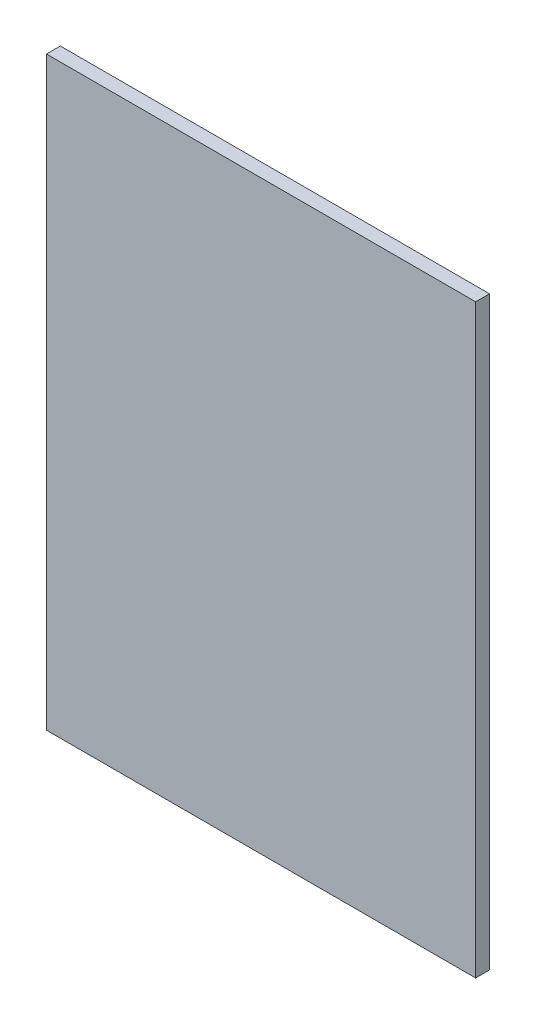
ISO-10303-21;
HEADER;
FILE_DESCRIPTION(('STEP AP214'),'2;1');
FILE_NAME('part.step','',(''),(''),'','','');
FILE_SCHEMA(('AUTOMOTIVE_DESIGN { 1 0 10303 214 1 1 1 1 }'));
ENDSEC;
DATA;
#1=APPLICATION_CONTEXT('core data for automotive mechanical design processes');
#2=APPLICATION_PROTOCOL_DEFINITION('international standard','automotive_design',2000,#1);
#3=PRODUCT_CONTEXT('',#1,'mechanical');
#4=PRODUCT('Part','Part','',(#3));
#5=PRODUCT_RELATED_PRODUCT_CATEGORY('part','',(#4));
#6=PRODUCT_DEFINITION_FORMATION('','',#4);
#7=PRODUCT_DEFINITION_CONTEXT('part definition',#1,'design');
#8=PRODUCT_DEFINITION('design','',#6,#7);
#9=PRODUCT_DEFINITION_SHAPE('','',#8);
#10=(LENGTH_UNIT() NAMED_UNIT(*) SI_UNIT(.MILLI.,.METRE.));
#11=(NAMED_UNIT(*) PLANE_ANGLE_UNIT() SI_UNIT($,.RADIAN.));
#12=(NAMED_UNIT(*) SI_UNIT($,.STERADIAN.) SOLID_ANGLE_UNIT());
#13=UNCERTAINTY_MEASURE_WITH_UNIT(LENGTH_MEASURE(1.E-05),#10,'distance_accuracy_value','');
#14=(GEOMETRIC_REPRESENTATION_CONTEXT(3) GLOBAL_UNCERTAINTY_ASSIGNED_CONTEXT((#13)) GLOBAL_UNIT_ASSIGNED_CONTEXT((#10,
#11,#12)) REPRESENTATION_CONTEXT('',''));
#15=CARTESIAN_POINT('',(0.,0.,0.));
#16=DIRECTION('',(0.,0.,1.));
#17=DIRECTION('',(1.,0.,0.));
#18=AXIS2_PLACEMENT_3D('',#15,#16,#17);
#19=CARTESIAN_POINT('',(0.,760.,18.));
#20=DIRECTION('',(0.,1.,0.));
#21=DIRECTION('',(0.,0.,1.));
#22=AXIS2_PLACEMENT_3D('',#19,#20,#21);
#23=PLANE('',#22);
#24=DIRECTION('',(1.,0.,0.));
#25=VECTOR('',#24,1.);
#26=CARTESIAN_POINT('',(0.,760.,0.));
#27=LINE('',#26,#25);
#28=CARTESIAN_POINT('',(0.,760.,0.));
#29=VERTEX_POINT('',#28);
#30=CARTESIAN_POINT('',(557.,760.,0.));
#31=VERTEX_POINT('',#30);
#32=EDGE_CURVE('E98',#29,#31,#27,.T.);
#33=ORIENTED_EDGE('',*,*,#32,.F.);
#34=DIRECTION('',(0.,0.,-1.));
#35=VECTOR('',#34,1.);
#36=CARTESIAN_POINT('',(0.,760.,18.));
#37=LINE('',#36,#35);
#38=CARTESIAN_POINT('',(0.,760.,18.));
#39=VERTEX_POINT('',#38);
#40=EDGE_CURVE('E11',#39,#29,#37,.T.);
#41=ORIENTED_EDGE('',*,*,#40,.F.);
#42=DIRECTION('',(1.,0.,0.));
#43=VECTOR('',#42,1.);
#44=CARTESIAN_POINT('',(0.,760.,18.));
#45=LINE('',#44,#43);
#46=CARTESIAN_POINT('',(557.,760.,18.));
#47=VERTEX_POINT('',#46);
#48=EDGE_CURVE('E93',#39,#47,#45,.T.);
#49=ORIENTED_EDGE('',*,*,#48,.T.);
#50=DIRECTION('',(0.,0.,-1.));
#51=VECTOR('',#50,1.);
#52=CARTESIAN_POINT('',(557.,760.,18.));
#53=LINE('',#52,#51);
#54=EDGE_CURVE('E36',#47,#31,#53,.T.);
#55=ORIENTED_EDGE('',*,*,#54,.T.);
#56=EDGE_LOOP('',(#33,#41,#49,#55));
#57=FACE_BOUND('',#56,.T.);
#58=ADVANCED_FACE('F33',(#57),#23,.T.);
#59=CARTESIAN_POINT('',(0.,760.,18.));
#60=DIRECTION('',(1.,0.,0.));
#61=DIRECTION('',(0.,0.,-1.));
#62=AXIS2_PLACEMENT_3D('',#59,#60,#61);
#63=PLANE('',#62);
#64=DIRECTION('',(0.,-1.,0.));
#65=VECTOR('',#64,1.);
#66=CARTESIAN_POINT('',(0.,760.,0.));
#67=LINE('',#66,#65);
#68=CARTESIAN_POINT('',(0.,0.,0.));
#69=VERTEX_POINT('',#68);
#70=EDGE_CURVE('E66',#29,#69,#67,.T.);
#71=ORIENTED_EDGE('',*,*,#70,.T.);
#72=DIRECTION('',(0.,0.,-1.));
#73=VECTOR('',#72,1.);
#74=CARTESIAN_POINT('',(0.,0.,18.));
#75=LINE('',#74,#73);
#76=CARTESIAN_POINT('',(0.,0.,18.));
#77=VERTEX_POINT('',#76);
#78=EDGE_CURVE('E42',#77,#69,#75,.T.);
#79=ORIENTED_EDGE('',*,*,#78,.F.);
#80=DIRECTION('',(0.,-1.,0.));
#81=VECTOR('',#80,1.);
#82=CARTESIAN_POINT('',(0.,760.,18.));
#83=LINE('',#82,#81);
#84=EDGE_CURVE('E83',#39,#77,#83,.T.);
#85=ORIENTED_EDGE('',*,*,#84,.F.);
#86=ORIENTED_EDGE('',*,*,#40,.T.);
#87=EDGE_LOOP('',(#71,#79,#85,#86));
#88=FACE_BOUND('',#87,.T.);
#89=ADVANCED_FACE('F108',(#88),#63,.F.);
#90=CARTESIAN_POINT('',(0.,0.,18.));
#91=DIRECTION('',(0.,1.,0.));
#92=DIRECTION('',(0.,0.,1.));
#93=AXIS2_PLACEMENT_3D('',#90,#91,#92);
#94=PLANE('',#93);
#95=DIRECTION('',(1.,0.,0.));
#96=VECTOR('',#95,1.);
#97=CARTESIAN_POINT('',(0.,0.,0.));
#98=LINE('',#97,#96);
#99=CARTESIAN_POINT('',(557.,0.,0.));
#100=VERTEX_POINT('',#99);
#101=EDGE_CURVE('E90',#69,#100,#98,.T.);
#102=ORIENTED_EDGE('',*,*,#101,.T.);
#103=DIRECTION('',(0.,0.,-1.));
#104=VECTOR('',#103,1.);
#105=CARTESIAN_POINT('',(557.,0.,18.));
#106=LINE('',#105,#104);
#107=CARTESIAN_POINT('',(557.,0.,18.));
#108=VERTEX_POINT('',#107);
#109=EDGE_CURVE('E87',#108,#100,#106,.T.);
#110=ORIENTED_EDGE('',*,*,#109,.F.);
#111=DIRECTION('',(1.,0.,0.));
#112=VECTOR('',#111,1.);
#113=CARTESIAN_POINT('',(0.,0.,18.));
#114=LINE('',#113,#112);
#115=EDGE_CURVE('E78',#77,#108,#114,.T.);
#116=ORIENTED_EDGE('',*,*,#115,.F.);
#117=ORIENTED_EDGE('',*,*,#78,.T.);
#118=EDGE_LOOP('',(#102,#110,#116,#117));
#119=FACE_BOUND('',#118,.T.);
#120=ADVANCED_FACE('F88',(#119),#94,.F.);
#121=CARTESIAN_POINT('',(557.,760.,18.));
#122=DIRECTION('',(1.,0.,0.));
#123=DIRECTION('',(0.,1.,0.));
#124=AXIS2_PLACEMENT_3D('',#121,#122,#123);
#125=PLANE('',#124);
#126=DIRECTION('',(0.,-1.,0.));
#127=VECTOR('',#126,1.);
#128=CARTESIAN_POINT('',(557.,760.,0.));
#129=LINE('',#128,#127);
#130=EDGE_CURVE('E101',#31,#100,#129,.T.);
#131=ORIENTED_EDGE('',*,*,#130,.F.);
#132=ORIENTED_EDGE('',*,*,#54,.F.);
#133=DIRECTION('',(0.,-1.,0.));
#134=VECTOR('',#133,1.);
#135=CARTESIAN_POINT('',(557.,760.,18.));
#136=LINE('',#135,#134);
#137=EDGE_CURVE('E82',#47,#108,#136,.T.);
#138=ORIENTED_EDGE('',*,*,#137,.T.);
#139=ORIENTED_EDGE('',*,*,#109,.T.);
#140=EDGE_LOOP('',(#131,#132,#138,#139));
#141=FACE_BOUND('',#140,.T.);
#142=ADVANCED_FACE('F92',(#141),#125,.T.);
#143=CARTESIAN_POINT('',(0.,0.,18.));
#144=DIRECTION('',(0.,0.,-1.));
#145=DIRECTION('',(-1.,0.,0.));
#146=AXIS2_PLACEMENT_3D('',#143,#144,#145);
#147=PLANE('',#146);
#148=ORIENTED_EDGE('',*,*,#48,.F.);
#149=ORIENTED_EDGE('',*,*,#84,.T.);
#150=ORIENTED_EDGE('',*,*,#115,.T.);
#151=ORIENTED_EDGE('',*,*,#137,.F.);
#152=EDGE_LOOP('',(#148,#149,#150,#151));
#153=FACE_BOUND('',#152,.T.);
#154=ADVANCED_FACE('F81',(#153),#147,.F.);
#155=CARTESIAN_POINT('',(0.,0.,0.));
#156=DIRECTION('',(0.,0.,-1.));
#157=DIRECTION('',(-1.,0.,0.));
#158=AXIS2_PLACEMENT_3D('',#155,#156,#157);
#159=PLANE('',#158);
#160=ORIENTED_EDGE('',*,*,#32,.T.);
#161=ORIENTED_EDGE('',*,*,#130,.T.);
#162=ORIENTED_EDGE('',*,*,#101,.F.);
#163=ORIENTED_EDGE('',*,*,#70,.F.);
#164=EDGE_LOOP('',(#160,#161,#162,#163));
#165=FACE_BOUND('',#164,.T.);
#166=ADVANCED_FACE('F106',(#165),#159,.T.);
#167=CLOSED_SHELL('',(#58,#89,#120,#142,#154,#166));
#168=MANIFOLD_SOLID_BREP('B2',#167);
#169=ADVANCED_BREP_SHAPE_REPRESENTATION('',(#18,#168),#14);
#170=SHAPE_DEFINITION_REPRESENTATION(#9,#169);
ENDSEC;
END-ISO-10303-21;
